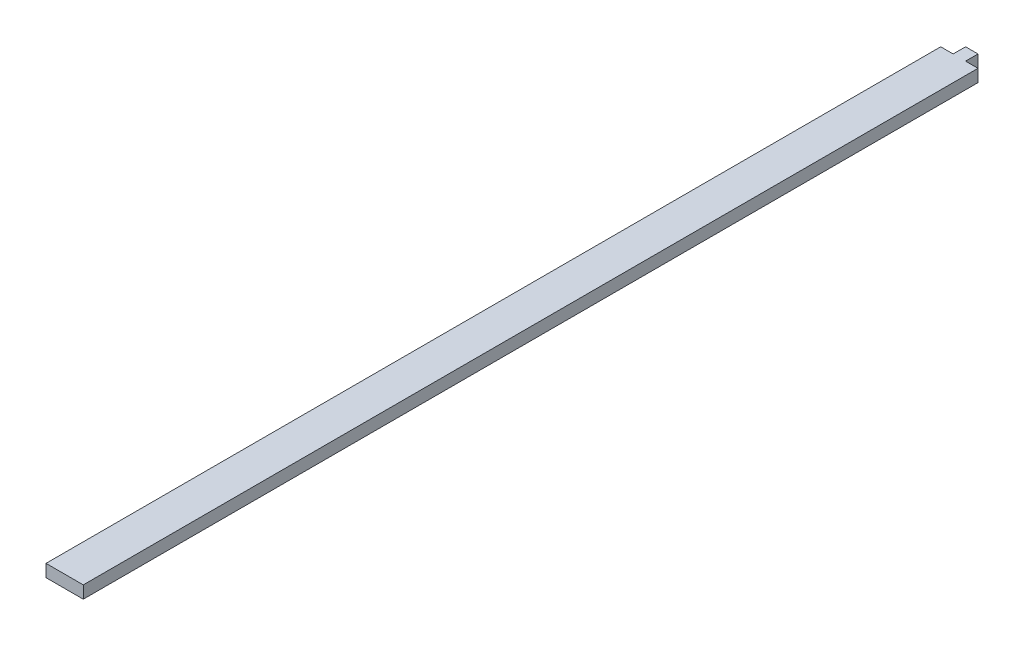
ISO-10303-21;
HEADER;
FILE_DESCRIPTION(('STEP AP214'),'2;1');
FILE_NAME('part.step','',(''),(''),'','','');
FILE_SCHEMA(('AUTOMOTIVE_DESIGN { 1 0 10303 214 1 1 1 1 }'));
ENDSEC;
DATA;
#1=APPLICATION_CONTEXT('core data for automotive mechanical design processes');
#2=APPLICATION_PROTOCOL_DEFINITION('international standard','automotive_design',2000,#1);
#3=PRODUCT_CONTEXT('',#1,'mechanical');
#4=PRODUCT('Part','Part','',(#3));
#5=PRODUCT_RELATED_PRODUCT_CATEGORY('part','',(#4));
#6=PRODUCT_DEFINITION_FORMATION('','',#4);
#7=PRODUCT_DEFINITION_CONTEXT('part definition',#1,'design');
#8=PRODUCT_DEFINITION('design','',#6,#7);
#9=PRODUCT_DEFINITION_SHAPE('','',#8);
#10=(LENGTH_UNIT() NAMED_UNIT(*) SI_UNIT(.MILLI.,.METRE.));
#11=(NAMED_UNIT(*) PLANE_ANGLE_UNIT() SI_UNIT($,.RADIAN.));
#12=(NAMED_UNIT(*) SI_UNIT($,.STERADIAN.) SOLID_ANGLE_UNIT());
#13=UNCERTAINTY_MEASURE_WITH_UNIT(LENGTH_MEASURE(1.E-05),#10,'distance_accuracy_value','');
#14=(GEOMETRIC_REPRESENTATION_CONTEXT(3) GLOBAL_UNCERTAINTY_ASSIGNED_CONTEXT((#13)) GLOBAL_UNIT_ASSIGNED_CONTEXT((#10,
#11,#12)) REPRESENTATION_CONTEXT('',''));
#15=CARTESIAN_POINT('',(0.,0.,0.));
#16=DIRECTION('',(0.,0.,1.));
#17=DIRECTION('',(1.,0.,0.));
#18=AXIS2_PLACEMENT_3D('',#15,#16,#17);
#19=CARTESIAN_POINT('',(0.,6.35,0.));
#20=DIRECTION('',(0.,0.,-1.));
#21=DIRECTION('',(-1.,0.,0.));
#22=AXIS2_PLACEMENT_3D('',#19,#20,#21);
#23=PLANE('',#22);
#24=DIRECTION('',(1.,0.,0.));
#25=VECTOR('',#24,1.);
#26=CARTESIAN_POINT('',(0.,0.,0.));
#27=LINE('',#26,#25);
#28=CARTESIAN_POINT('',(0.,0.,0.));
#29=VERTEX_POINT('',#28);
#30=CARTESIAN_POINT('',(19.05,0.,0.));
#31=VERTEX_POINT('',#30);
#32=EDGE_CURVE('E161',#29,#31,#27,.T.);
#33=ORIENTED_EDGE('',*,*,#32,.T.);
#34=DIRECTION('',(0.,-1.,0.));
#35=VECTOR('',#34,1.);
#36=CARTESIAN_POINT('',(19.05,6.35,0.));
#37=LINE('',#36,#35);
#38=CARTESIAN_POINT('',(19.05,6.35,0.));
#39=VERTEX_POINT('',#38);
#40=EDGE_CURVE('E11',#39,#31,#37,.T.);
#41=ORIENTED_EDGE('',*,*,#40,.F.);
#42=DIRECTION('',(1.,0.,0.));
#43=VECTOR('',#42,1.);
#44=CARTESIAN_POINT('',(0.,6.35,0.));
#45=LINE('',#44,#43);
#46=CARTESIAN_POINT('',(0.,6.35,0.));
#47=VERTEX_POINT('',#46);
#48=EDGE_CURVE('E136',#47,#39,#45,.T.);
#49=ORIENTED_EDGE('',*,*,#48,.F.);
#50=DIRECTION('',(0.,-1.,0.));
#51=VECTOR('',#50,1.);
#52=CARTESIAN_POINT('',(0.,6.35,0.));
#53=LINE('',#52,#51);
#54=EDGE_CURVE('E51',#47,#29,#53,.T.);
#55=ORIENTED_EDGE('',*,*,#54,.T.);
#56=EDGE_LOOP('',(#33,#41,#49,#55));
#57=FACE_BOUND('',#56,.T.);
#58=ADVANCED_FACE('F35',(#57),#23,.F.);
#59=CARTESIAN_POINT('',(19.05,6.35,0.));
#60=DIRECTION('',(-1.,0.,0.));
#61=DIRECTION('',(0.,0.,1.));
#62=AXIS2_PLACEMENT_3D('',#59,#60,#61);
#63=PLANE('',#62);
#64=DIRECTION('',(0.,0.,-1.));
#65=VECTOR('',#64,1.);
#66=CARTESIAN_POINT('',(19.05,0.,0.));
#67=LINE('',#66,#65);
#68=CARTESIAN_POINT('',(19.05,0.,-457.2));
#69=VERTEX_POINT('',#68);
#70=EDGE_CURVE('E159',#31,#69,#67,.T.);
#71=ORIENTED_EDGE('',*,*,#70,.T.);
#72=DIRECTION('',(0.,-1.,0.));
#73=VECTOR('',#72,1.);
#74=CARTESIAN_POINT('',(19.05,6.35,-457.2));
#75=LINE('',#74,#73);
#76=CARTESIAN_POINT('',(19.05,6.35,-457.2));
#77=VERTEX_POINT('',#76);
#78=EDGE_CURVE('E43',#77,#69,#75,.T.);
#79=ORIENTED_EDGE('',*,*,#78,.F.);
#80=DIRECTION('',(0.,0.,-1.));
#81=VECTOR('',#80,1.);
#82=CARTESIAN_POINT('',(19.05,6.35,0.));
#83=LINE('',#82,#81);
#84=EDGE_CURVE('E89',#39,#77,#83,.T.);
#85=ORIENTED_EDGE('',*,*,#84,.F.);
#86=ORIENTED_EDGE('',*,*,#40,.T.);
#87=EDGE_LOOP('',(#71,#79,#85,#86));
#88=FACE_BOUND('',#87,.T.);
#89=ADVANCED_FACE('F160',(#88),#63,.F.);
#90=CARTESIAN_POINT('',(0.,6.35,-457.2));
#91=DIRECTION('',(0.,0.,-1.));
#92=DIRECTION('',(-1.,0.,0.));
#93=AXIS2_PLACEMENT_3D('',#90,#91,#92);
#94=PLANE('',#93);
#95=DIRECTION('',(1.,0.,0.));
#96=VECTOR('',#95,1.);
#97=CARTESIAN_POINT('',(0.,0.,-457.2));
#98=LINE('',#97,#96);
#99=CARTESIAN_POINT('',(12.7,0.,-457.2));
#100=VERTEX_POINT('',#99);
#101=EDGE_CURVE('E145',#100,#69,#98,.T.);
#102=ORIENTED_EDGE('',*,*,#101,.F.);
#103=DIRECTION('',(0.,-1.,0.));
#104=VECTOR('',#103,1.);
#105=CARTESIAN_POINT('',(12.7,6.35,-457.2));
#106=LINE('',#105,#104);
#107=CARTESIAN_POINT('',(12.7,6.35,-457.2));
#108=VERTEX_POINT('',#107);
#109=EDGE_CURVE('E154',#108,#100,#106,.T.);
#110=ORIENTED_EDGE('',*,*,#109,.F.);
#111=DIRECTION('',(1.,0.,0.));
#112=VECTOR('',#111,1.);
#113=CARTESIAN_POINT('',(0.,6.35,-457.2));
#114=LINE('',#113,#112);
#115=EDGE_CURVE('E128',#108,#77,#114,.T.);
#116=ORIENTED_EDGE('',*,*,#115,.T.);
#117=ORIENTED_EDGE('',*,*,#78,.T.);
#118=EDGE_LOOP('',(#102,#110,#116,#117));
#119=FACE_BOUND('',#118,.T.);
#120=ADVANCED_FACE('F157',(#119),#94,.T.);
#121=CARTESIAN_POINT('',(12.7000000000001,6.35,0.));
#122=DIRECTION('',(-1.,0.,0.));
#123=DIRECTION('',(0.,0.,1.));
#124=AXIS2_PLACEMENT_3D('',#121,#122,#123);
#125=PLANE('',#124);
#126=DIRECTION('',(0.,0.,-1.));
#127=VECTOR('',#126,1.);
#128=CARTESIAN_POINT('',(12.7000000000001,0.,0.));
#129=LINE('',#128,#127);
#130=CARTESIAN_POINT('',(12.7,0.,-463.55));
#131=VERTEX_POINT('',#130);
#132=EDGE_CURVE('E167',#100,#131,#129,.T.);
#133=ORIENTED_EDGE('',*,*,#132,.T.);
#134=DIRECTION('',(0.,-1.,0.));
#135=VECTOR('',#134,1.);
#136=CARTESIAN_POINT('',(12.7,6.35,-463.55));
#137=LINE('',#136,#135);
#138=CARTESIAN_POINT('',(12.7,6.35,-463.55));
#139=VERTEX_POINT('',#138);
#140=EDGE_CURVE('E152',#139,#131,#137,.T.);
#141=ORIENTED_EDGE('',*,*,#140,.F.);
#142=DIRECTION('',(0.,0.,-1.));
#143=VECTOR('',#142,1.);
#144=CARTESIAN_POINT('',(12.7000000000001,6.35,0.));
#145=LINE('',#144,#143);
#146=EDGE_CURVE('E133',#108,#139,#145,.T.);
#147=ORIENTED_EDGE('',*,*,#146,.F.);
#148=ORIENTED_EDGE('',*,*,#109,.T.);
#149=EDGE_LOOP('',(#133,#141,#147,#148));
#150=FACE_BOUND('',#149,.T.);
#151=ADVANCED_FACE('F177',(#150),#125,.F.);
#152=CARTESIAN_POINT('',(0.,6.35,-463.55));
#153=DIRECTION('',(0.,0.,-1.));
#154=DIRECTION('',(-1.,0.,0.));
#155=AXIS2_PLACEMENT_3D('',#152,#153,#154);
#156=PLANE('',#155);
#157=DIRECTION('',(1.,0.,0.));
#158=VECTOR('',#157,1.);
#159=CARTESIAN_POINT('',(0.,0.,-463.55));
#160=LINE('',#159,#158);
#161=CARTESIAN_POINT('',(6.35,0.,-463.55));
#162=VERTEX_POINT('',#161);
#163=EDGE_CURVE('E168',#162,#131,#160,.T.);
#164=ORIENTED_EDGE('',*,*,#163,.F.);
#165=DIRECTION('',(0.,-1.,0.));
#166=VECTOR('',#165,1.);
#167=CARTESIAN_POINT('',(6.35,6.35,-463.55));
#168=LINE('',#167,#166);
#169=CARTESIAN_POINT('',(6.35,6.35,-463.55));
#170=VERTEX_POINT('',#169);
#171=EDGE_CURVE('E114',#170,#162,#168,.T.);
#172=ORIENTED_EDGE('',*,*,#171,.F.);
#173=DIRECTION('',(1.,0.,0.));
#174=VECTOR('',#173,1.);
#175=CARTESIAN_POINT('',(0.,6.35,-463.55));
#176=LINE('',#175,#174);
#177=EDGE_CURVE('E123',#170,#139,#176,.T.);
#178=ORIENTED_EDGE('',*,*,#177,.T.);
#179=ORIENTED_EDGE('',*,*,#140,.T.);
#180=EDGE_LOOP('',(#164,#172,#178,#179));
#181=FACE_BOUND('',#180,.T.);
#182=ADVANCED_FACE('F173',(#181),#156,.T.);
#183=CARTESIAN_POINT('',(6.35,6.35,0.));
#184=DIRECTION('',(-1.,0.,0.));
#185=DIRECTION('',(0.,0.,1.));
#186=AXIS2_PLACEMENT_3D('',#183,#184,#185);
#187=PLANE('',#186);
#188=DIRECTION('',(0.,0.,-1.));
#189=VECTOR('',#188,1.);
#190=CARTESIAN_POINT('',(6.35,0.,0.));
#191=LINE('',#190,#189);
#192=CARTESIAN_POINT('',(6.35,0.,-457.2));
#193=VERTEX_POINT('',#192);
#194=EDGE_CURVE('E110',#193,#162,#191,.T.);
#195=ORIENTED_EDGE('',*,*,#194,.F.);
#196=DIRECTION('',(0.,-1.,0.));
#197=VECTOR('',#196,1.);
#198=CARTESIAN_POINT('',(6.35,6.35,-457.2));
#199=LINE('',#198,#197);
#200=CARTESIAN_POINT('',(6.35,6.35,-457.2));
#201=VERTEX_POINT('',#200);
#202=EDGE_CURVE('E105',#201,#193,#199,.T.);
#203=ORIENTED_EDGE('',*,*,#202,.F.);
#204=DIRECTION('',(0.,0.,-1.));
#205=VECTOR('',#204,1.);
#206=CARTESIAN_POINT('',(6.35,6.35,0.));
#207=LINE('',#206,#205);
#208=EDGE_CURVE('E108',#201,#170,#207,.T.);
#209=ORIENTED_EDGE('',*,*,#208,.T.);
#210=ORIENTED_EDGE('',*,*,#171,.T.);
#211=EDGE_LOOP('',(#195,#203,#209,#210));
#212=FACE_BOUND('',#211,.T.);
#213=ADVANCED_FACE('F107',(#212),#187,.T.);
#214=CARTESIAN_POINT('',(0.,0.,-457.2));
#215=VERTEX_POINT('',#214);
#216=EDGE_CURVE('E141',#215,#193,#98,.T.);
#217=ORIENTED_EDGE('',*,*,#216,.F.);
#218=DIRECTION('',(0.,-1.,0.));
#219=VECTOR('',#218,1.);
#220=CARTESIAN_POINT('',(0.,6.35,-457.2));
#221=LINE('',#220,#219);
#222=CARTESIAN_POINT('',(0.,6.35,-457.2));
#223=VERTEX_POINT('',#222);
#224=EDGE_CURVE('E77',#223,#215,#221,.T.);
#225=ORIENTED_EDGE('',*,*,#224,.F.);
#226=EDGE_CURVE('E121',#223,#201,#114,.T.);
#227=ORIENTED_EDGE('',*,*,#226,.T.);
#228=ORIENTED_EDGE('',*,*,#202,.T.);
#229=EDGE_LOOP('',(#217,#225,#227,#228));
#230=FACE_BOUND('',#229,.T.);
#231=ADVANCED_FACE('F125',(#230),#94,.T.);
#232=CARTESIAN_POINT('',(0.,6.35,0.));
#233=DIRECTION('',(-1.,0.,0.));
#234=DIRECTION('',(0.,0.,1.));
#235=AXIS2_PLACEMENT_3D('',#232,#233,#234);
#236=PLANE('',#235);
#237=DIRECTION('',(0.,0.,-1.));
#238=VECTOR('',#237,1.);
#239=CARTESIAN_POINT('',(0.,0.,0.));
#240=LINE('',#239,#238);
#241=EDGE_CURVE('E137',#29,#215,#240,.T.);
#242=ORIENTED_EDGE('',*,*,#241,.F.);
#243=ORIENTED_EDGE('',*,*,#54,.F.);
#244=DIRECTION('',(0.,0.,-1.));
#245=VECTOR('',#244,1.);
#246=CARTESIAN_POINT('',(0.,6.35,0.));
#247=LINE('',#246,#245);
#248=EDGE_CURVE('E126',#47,#223,#247,.T.);
#249=ORIENTED_EDGE('',*,*,#248,.T.);
#250=ORIENTED_EDGE('',*,*,#224,.T.);
#251=EDGE_LOOP('',(#242,#243,#249,#250));
#252=FACE_BOUND('',#251,.T.);
#253=ADVANCED_FACE('F191',(#252),#236,.T.);
#254=CARTESIAN_POINT('',(0.,6.35,0.));
#255=DIRECTION('',(0.,1.,0.));
#256=DIRECTION('',(0.,0.,1.));
#257=AXIS2_PLACEMENT_3D('',#254,#255,#256);
#258=PLANE('',#257);
#259=ORIENTED_EDGE('',*,*,#48,.T.);
#260=ORIENTED_EDGE('',*,*,#84,.T.);
#261=ORIENTED_EDGE('',*,*,#115,.F.);
#262=ORIENTED_EDGE('',*,*,#146,.T.);
#263=ORIENTED_EDGE('',*,*,#177,.F.);
#264=ORIENTED_EDGE('',*,*,#208,.F.);
#265=ORIENTED_EDGE('',*,*,#226,.F.);
#266=ORIENTED_EDGE('',*,*,#248,.F.);
#267=EDGE_LOOP('',(#259,#260,#261,#262,#263,#264,#265,#266));
#268=FACE_BOUND('',#267,.T.);
#269=ADVANCED_FACE('F119',(#268),#258,.T.);
#270=CARTESIAN_POINT('',(0.,0.,0.));
#271=DIRECTION('',(0.,1.,0.));
#272=DIRECTION('',(0.,0.,1.));
#273=AXIS2_PLACEMENT_3D('',#270,#271,#272);
#274=PLANE('',#273);
#275=ORIENTED_EDGE('',*,*,#32,.F.);
#276=ORIENTED_EDGE('',*,*,#241,.T.);
#277=ORIENTED_EDGE('',*,*,#216,.T.);
#278=ORIENTED_EDGE('',*,*,#194,.T.);
#279=ORIENTED_EDGE('',*,*,#163,.T.);
#280=ORIENTED_EDGE('',*,*,#132,.F.);
#281=ORIENTED_EDGE('',*,*,#101,.T.);
#282=ORIENTED_EDGE('',*,*,#70,.F.);
#283=EDGE_LOOP('',(#275,#276,#277,#278,#279,#280,#281,#282));
#284=FACE_BOUND('',#283,.T.);
#285=ADVANCED_FACE('F164',(#284),#274,.F.);
#286=CLOSED_SHELL('',(#58,#89,#120,#151,#182,#213,#231,#253,#269,#285));
#287=MANIFOLD_SOLID_BREP('B2',#286);
#288=ADVANCED_BREP_SHAPE_REPRESENTATION('',(#18,#287),#14);
#289=SHAPE_DEFINITION_REPRESENTATION(#9,#288);
ENDSEC;
END-ISO-10303-21;
